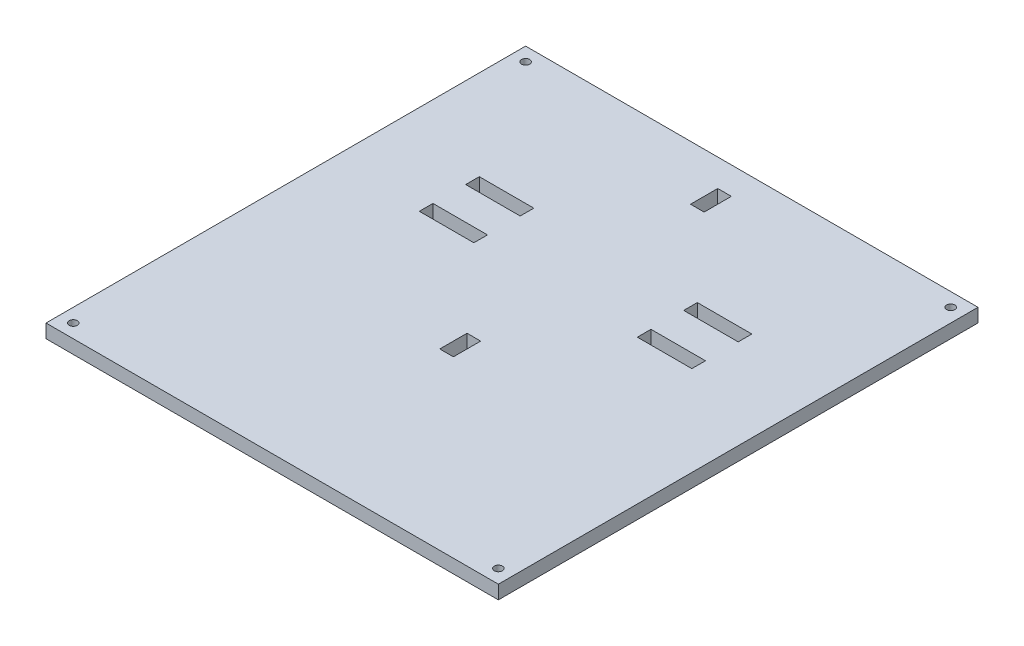
ISO-10303-21;
HEADER;
FILE_DESCRIPTION(('STEP AP214'),'2;1');
FILE_NAME('part.step','',(''),(''),'','','');
FILE_SCHEMA(('AUTOMOTIVE_DESIGN { 1 0 10303 214 1 1 1 1 }'));
ENDSEC;
DATA;
#1=APPLICATION_CONTEXT('core data for automotive mechanical design processes');
#2=APPLICATION_PROTOCOL_DEFINITION('international standard','automotive_design',2000,#1);
#3=PRODUCT_CONTEXT('',#1,'mechanical');
#4=PRODUCT('Part','Part','',(#3));
#5=PRODUCT_RELATED_PRODUCT_CATEGORY('part','',(#4));
#6=PRODUCT_DEFINITION_FORMATION('','',#4);
#7=PRODUCT_DEFINITION_CONTEXT('part definition',#1,'design');
#8=PRODUCT_DEFINITION('design','',#6,#7);
#9=PRODUCT_DEFINITION_SHAPE('','',#8);
#10=(LENGTH_UNIT() NAMED_UNIT(*) SI_UNIT(.MILLI.,.METRE.));
#11=(NAMED_UNIT(*) PLANE_ANGLE_UNIT() SI_UNIT($,.RADIAN.));
#12=(NAMED_UNIT(*) SI_UNIT($,.STERADIAN.) SOLID_ANGLE_UNIT());
#13=UNCERTAINTY_MEASURE_WITH_UNIT(LENGTH_MEASURE(1.E-05),#10,'distance_accuracy_value','');
#14=(GEOMETRIC_REPRESENTATION_CONTEXT(3) GLOBAL_UNCERTAINTY_ASSIGNED_CONTEXT((#13)) GLOBAL_UNIT_ASSIGNED_CONTEXT((#10,
#11,#12)) REPRESENTATION_CONTEXT('',''));
#15=CARTESIAN_POINT('',(0.,0.,0.));
#16=DIRECTION('',(0.,0.,1.));
#17=DIRECTION('',(1.,0.,0.));
#18=AXIS2_PLACEMENT_3D('',#15,#16,#17);
#19=CARTESIAN_POINT('',(0.,5.,0.));
#20=DIRECTION('',(0.,-1.,0.));
#21=DIRECTION('',(0.,0.,-1.));
#22=AXIS2_PLACEMENT_3D('',#19,#20,#21);
#23=PLANE('',#22);
#24=DIRECTION('',(0.,0.,1.));
#25=VECTOR('',#24,1.);
#26=CARTESIAN_POINT('',(80.5,5.,-120.522242689147));
#27=LINE('',#26,#25);
#28=CARTESIAN_POINT('',(80.5,5.,-120.522242689147));
#29=VERTEX_POINT('',#28);
#30=CARTESIAN_POINT('',(80.5,5.,-110.522242689147));
#31=VERTEX_POINT('',#30);
#32=EDGE_CURVE('E259',#29,#31,#27,.T.);
#33=ORIENTED_EDGE('',*,*,#32,.F.);
#34=DIRECTION('',(-1.,0.,0.));
#35=VECTOR('',#34,1.);
#36=CARTESIAN_POINT('',(80.5,5.,-120.522242689147));
#37=LINE('',#36,#35);
#38=CARTESIAN_POINT('',(85.5,5.,-120.522242689147));
#39=VERTEX_POINT('',#38);
#40=EDGE_CURVE('E267',#39,#29,#37,.T.);
#41=ORIENTED_EDGE('',*,*,#40,.F.);
#42=DIRECTION('',(0.,0.,-1.));
#43=VECTOR('',#42,1.);
#44=CARTESIAN_POINT('',(85.5,5.,-120.522242689147));
#45=LINE('',#44,#43);
#46=CARTESIAN_POINT('',(85.5,5.,-110.522242689147));
#47=VERTEX_POINT('',#46);
#48=EDGE_CURVE('E264',#47,#39,#45,.T.);
#49=ORIENTED_EDGE('',*,*,#48,.F.);
#50=DIRECTION('',(1.,0.,0.));
#51=VECTOR('',#50,1.);
#52=CARTESIAN_POINT('',(80.5,5.,-110.522242689147));
#53=LINE('',#52,#51);
#54=EDGE_CURVE('E261',#31,#47,#53,.T.);
#55=ORIENTED_EDGE('',*,*,#54,.F.);
#56=EDGE_LOOP('',(#33,#41,#49,#55));
#57=FACE_BOUND('',#56,.T.);
#58=DIRECTION('',(0.,0.,1.));
#59=VECTOR('',#58,1.);
#60=CARTESIAN_POINT('',(113.,5.,-80.5222426891473));
#61=LINE('',#60,#59);
#62=CARTESIAN_POINT('',(113.,5.,-80.5222426891473));
#63=VERTEX_POINT('',#62);
#64=CARTESIAN_POINT('',(113.,5.,-75.5222426891473));
#65=VERTEX_POINT('',#64);
#66=EDGE_CURVE('E321',#63,#65,#61,.T.);
#67=ORIENTED_EDGE('',*,*,#66,.F.);
#68=DIRECTION('',(-1.,0.,0.));
#69=VECTOR('',#68,1.);
#70=CARTESIAN_POINT('',(113.,5.,-80.5222426891473));
#71=LINE('',#70,#69);
#72=CARTESIAN_POINT('',(133.,5.,-80.5222426891473));
#73=VERTEX_POINT('',#72);
#74=EDGE_CURVE('E329',#73,#63,#71,.T.);
#75=ORIENTED_EDGE('',*,*,#74,.F.);
#76=DIRECTION('',(0.,0.,-1.));
#77=VECTOR('',#76,1.);
#78=CARTESIAN_POINT('',(133.,5.,-80.5222426891473));
#79=LINE('',#78,#77);
#80=CARTESIAN_POINT('',(133.,5.,-75.5222426891473));
#81=VERTEX_POINT('',#80);
#82=EDGE_CURVE('E326',#81,#73,#79,.T.);
#83=ORIENTED_EDGE('',*,*,#82,.F.);
#84=DIRECTION('',(1.,0.,0.));
#85=VECTOR('',#84,1.);
#86=CARTESIAN_POINT('',(113.,5.,-75.5222426891473));
#87=LINE('',#86,#85);
#88=EDGE_CURVE('E323',#65,#81,#87,.T.);
#89=ORIENTED_EDGE('',*,*,#88,.F.);
#90=EDGE_LOOP('',(#67,#75,#83,#89));
#91=FACE_BOUND('',#90,.T.);
#92=DIRECTION('',(0.,0.,-1.));
#93=VECTOR('',#92,1.);
#94=CARTESIAN_POINT('',(53.,5.,-80.5222426891473));
#95=LINE('',#94,#93);
#96=CARTESIAN_POINT('',(53.,5.,-75.5222426891473));
#97=VERTEX_POINT('',#96);
#98=CARTESIAN_POINT('',(53.,5.,-80.5222426891473));
#99=VERTEX_POINT('',#98);
#100=EDGE_CURVE('E383',#97,#99,#95,.T.);
#101=ORIENTED_EDGE('',*,*,#100,.F.);
#102=DIRECTION('',(1.,0.,0.));
#103=VECTOR('',#102,1.);
#104=CARTESIAN_POINT('',(53.,5.,-75.5222426891473));
#105=LINE('',#104,#103);
#106=CARTESIAN_POINT('',(33.,5.,-75.5222426891473));
#107=VERTEX_POINT('',#106);
#108=EDGE_CURVE('E391',#107,#97,#105,.T.);
#109=ORIENTED_EDGE('',*,*,#108,.F.);
#110=DIRECTION('',(0.,0.,1.));
#111=VECTOR('',#110,1.);
#112=CARTESIAN_POINT('',(33.,5.,-80.5222426891473));
#113=LINE('',#112,#111);
#114=CARTESIAN_POINT('',(33.,5.,-80.5222426891473));
#115=VERTEX_POINT('',#114);
#116=EDGE_CURVE('E388',#115,#107,#113,.T.);
#117=ORIENTED_EDGE('',*,*,#116,.F.);
#118=DIRECTION('',(-1.,0.,0.));
#119=VECTOR('',#118,1.);
#120=CARTESIAN_POINT('',(53.,5.,-80.5222426891473));
#121=LINE('',#120,#119);
#122=EDGE_CURVE('E385',#99,#115,#121,.T.);
#123=ORIENTED_EDGE('',*,*,#122,.F.);
#124=EDGE_LOOP('',(#101,#109,#117,#123));
#125=FACE_BOUND('',#124,.T.);
#126=DIRECTION('',(0.,0.,1.));
#127=VECTOR('',#126,1.);
#128=CARTESIAN_POINT('',(0.,5.,45.4777573108528));
#129=LINE('',#128,#127);
#130=CARTESIAN_POINT('',(0.,5.,-130.522242689147));
#131=VERTEX_POINT('',#130);
#132=CARTESIAN_POINT('',(0.,5.,45.4777573108528));
#133=VERTEX_POINT('',#132);
#134=EDGE_CURVE('E414',#131,#133,#129,.T.);
#135=ORIENTED_EDGE('',*,*,#134,.T.);
#136=DIRECTION('',(1.,0.,0.));
#137=VECTOR('',#136,1.);
#138=CARTESIAN_POINT('',(166.,5.,45.4777573108528));
#139=LINE('',#138,#137);
#140=CARTESIAN_POINT('',(166.,5.,45.4777573108528));
#141=VERTEX_POINT('',#140);
#142=EDGE_CURVE('E417',#133,#141,#139,.T.);
#143=ORIENTED_EDGE('',*,*,#142,.T.);
#144=DIRECTION('',(0.,0.,-1.));
#145=VECTOR('',#144,1.);
#146=CARTESIAN_POINT('',(166.,5.,0.));
#147=LINE('',#146,#145);
#148=CARTESIAN_POINT('',(166.,5.,-130.522242689147));
#149=VERTEX_POINT('',#148);
#150=EDGE_CURVE('E420',#141,#149,#147,.T.);
#151=ORIENTED_EDGE('',*,*,#150,.T.);
#152=DIRECTION('',(-1.,0.,0.));
#153=VECTOR('',#152,1.);
#154=CARTESIAN_POINT('',(0.,5.,-130.522242689147));
#155=LINE('',#154,#153);
#156=EDGE_CURVE('E422',#149,#131,#155,.T.);
#157=ORIENTED_EDGE('',*,*,#156,.T.);
#158=EDGE_LOOP('',(#135,#143,#151,#157));
#159=FACE_BOUND('',#158,.T.);
#160=DIRECTION('',(0.,0.,-1.));
#161=VECTOR('',#160,1.);
#162=CARTESIAN_POINT('',(53.,5.,-63.5222426891472));
#163=LINE('',#162,#161);
#164=CARTESIAN_POINT('',(53.,5.,-58.5222426891472));
#165=VERTEX_POINT('',#164);
#166=CARTESIAN_POINT('',(53.,5.,-63.5222426891472));
#167=VERTEX_POINT('',#166);
#168=EDGE_CURVE('E352',#165,#167,#163,.T.);
#169=ORIENTED_EDGE('',*,*,#168,.F.);
#170=DIRECTION('',(1.,0.,0.));
#171=VECTOR('',#170,1.);
#172=CARTESIAN_POINT('',(53.,5.,-58.5222426891472));
#173=LINE('',#172,#171);
#174=CARTESIAN_POINT('',(33.,5.,-58.5222426891472));
#175=VERTEX_POINT('',#174);
#176=EDGE_CURVE('E360',#175,#165,#173,.T.);
#177=ORIENTED_EDGE('',*,*,#176,.F.);
#178=DIRECTION('',(0.,0.,1.));
#179=VECTOR('',#178,1.);
#180=CARTESIAN_POINT('',(33.,5.,-63.5222426891472));
#181=LINE('',#180,#179);
#182=CARTESIAN_POINT('',(33.,5.,-63.5222426891472));
#183=VERTEX_POINT('',#182);
#184=EDGE_CURVE('E357',#183,#175,#181,.T.);
#185=ORIENTED_EDGE('',*,*,#184,.F.);
#186=DIRECTION('',(-1.,0.,0.));
#187=VECTOR('',#186,1.);
#188=CARTESIAN_POINT('',(53.,5.,-63.5222426891472));
#189=LINE('',#188,#187);
#190=EDGE_CURVE('E354',#167,#183,#189,.T.);
#191=ORIENTED_EDGE('',*,*,#190,.F.);
#192=EDGE_LOOP('',(#169,#177,#185,#191));
#193=FACE_BOUND('',#192,.T.);
#194=DIRECTION('',(0.,0.,1.));
#195=VECTOR('',#194,1.);
#196=CARTESIAN_POINT('',(113.,5.,-63.5222426891472));
#197=LINE('',#196,#195);
#198=CARTESIAN_POINT('',(113.,5.,-63.5222426891472));
#199=VERTEX_POINT('',#198);
#200=CARTESIAN_POINT('',(113.,5.,-58.5222426891472));
#201=VERTEX_POINT('',#200);
#202=EDGE_CURVE('E290',#199,#201,#197,.T.);
#203=ORIENTED_EDGE('',*,*,#202,.F.);
#204=DIRECTION('',(-1.,0.,0.));
#205=VECTOR('',#204,1.);
#206=CARTESIAN_POINT('',(113.,5.,-63.5222426891472));
#207=LINE('',#206,#205);
#208=CARTESIAN_POINT('',(133.,5.,-63.5222426891472));
#209=VERTEX_POINT('',#208);
#210=EDGE_CURVE('E298',#209,#199,#207,.T.);
#211=ORIENTED_EDGE('',*,*,#210,.F.);
#212=DIRECTION('',(0.,0.,-1.));
#213=VECTOR('',#212,1.);
#214=CARTESIAN_POINT('',(133.,5.,-63.5222426891472));
#215=LINE('',#214,#213);
#216=CARTESIAN_POINT('',(133.,5.,-58.5222426891472));
#217=VERTEX_POINT('',#216);
#218=EDGE_CURVE('E295',#217,#209,#215,.T.);
#219=ORIENTED_EDGE('',*,*,#218,.F.);
#220=DIRECTION('',(1.,0.,0.));
#221=VECTOR('',#220,1.);
#222=CARTESIAN_POINT('',(113.,5.,-58.5222426891472));
#223=LINE('',#222,#221);
#224=EDGE_CURVE('E292',#201,#217,#223,.T.);
#225=ORIENTED_EDGE('',*,*,#224,.F.);
#226=EDGE_LOOP('',(#203,#211,#219,#225));
#227=FACE_BOUND('',#226,.T.);
#228=DIRECTION('',(0.,0.,1.));
#229=VECTOR('',#228,1.);
#230=CARTESIAN_POINT('',(80.5,5.,-28.5222426891472));
#231=LINE('',#230,#229);
#232=CARTESIAN_POINT('',(80.5,5.,-28.5222426891472));
#233=VERTEX_POINT('',#232);
#234=CARTESIAN_POINT('',(80.5,5.,-18.5222426891472));
#235=VERTEX_POINT('',#234);
#236=EDGE_CURVE('E220',#233,#235,#231,.T.);
#237=ORIENTED_EDGE('',*,*,#236,.F.);
#238=DIRECTION('',(-1.,0.,0.));
#239=VECTOR('',#238,1.);
#240=CARTESIAN_POINT('',(80.5,5.,-28.5222426891472));
#241=LINE('',#240,#239);
#242=CARTESIAN_POINT('',(85.5,5.,-28.5222426891472));
#243=VERTEX_POINT('',#242);
#244=EDGE_CURVE('E243',#243,#233,#241,.T.);
#245=ORIENTED_EDGE('',*,*,#244,.F.);
#246=DIRECTION('',(0.,0.,-1.));
#247=VECTOR('',#246,1.);
#248=CARTESIAN_POINT('',(85.5,5.,-28.5222426891472));
#249=LINE('',#248,#247);
#250=CARTESIAN_POINT('',(85.5,5.,-18.5222426891472));
#251=VERTEX_POINT('',#250);
#252=EDGE_CURVE('E241',#251,#243,#249,.T.);
#253=ORIENTED_EDGE('',*,*,#252,.F.);
#254=DIRECTION('',(1.,0.,0.));
#255=VECTOR('',#254,1.);
#256=CARTESIAN_POINT('',(80.5,5.,-18.5222426891472));
#257=LINE('',#256,#255);
#258=EDGE_CURVE('E228',#235,#251,#257,.T.);
#259=ORIENTED_EDGE('',*,*,#258,.F.);
#260=EDGE_LOOP('',(#237,#245,#253,#259));
#261=FACE_BOUND('',#260,.T.);
#262=CARTESIAN_POINT('',(5.,5.,-125.522242689147));
#263=DIRECTION('',(0.,1.,0.));
#264=DIRECTION('',(0.,0.,1.));
#265=AXIS2_PLACEMENT_3D('',#262,#263,#264);
#266=CIRCLE('',#265,1.5);
#267=CARTESIAN_POINT('',(5.,5.,-124.022242689147));
#268=VERTEX_POINT('',#267);
#269=EDGE_CURVE('E249',#268,#268,#266,.T.);
#270=ORIENTED_EDGE('',*,*,#269,.F.);
#271=EDGE_LOOP('',(#270));
#272=FACE_BOUND('',#271,.T.);
#273=CARTESIAN_POINT('',(161.,5.,-125.522242689147));
#274=DIRECTION('',(0.,1.,0.));
#275=DIRECTION('',(0.,0.,1.));
#276=AXIS2_PLACEMENT_3D('',#273,#274,#275);
#277=CIRCLE('',#276,1.5);
#278=CARTESIAN_POINT('',(161.,5.,-124.022242689147));
#279=VERTEX_POINT('',#278);
#280=EDGE_CURVE('E811',#279,#279,#277,.T.);
#281=ORIENTED_EDGE('',*,*,#280,.F.);
#282=EDGE_LOOP('',(#281));
#283=FACE_BOUND('',#282,.T.);
#284=CARTESIAN_POINT('',(5.00000000000002,5.,40.4777573108528));
#285=DIRECTION('',(0.,1.,0.));
#286=DIRECTION('',(0.,0.,1.));
#287=AXIS2_PLACEMENT_3D('',#284,#285,#286);
#288=CIRCLE('',#287,1.5);
#289=CARTESIAN_POINT('',(5.00000000000002,5.,41.9777573108528));
#290=VERTEX_POINT('',#289);
#291=EDGE_CURVE('E805',#290,#290,#288,.T.);
#292=ORIENTED_EDGE('',*,*,#291,.F.);
#293=EDGE_LOOP('',(#292));
#294=FACE_BOUND('',#293,.T.);
#295=CARTESIAN_POINT('',(161.,5.,40.4777573108528));
#296=DIRECTION('',(0.,1.,0.));
#297=DIRECTION('',(0.,0.,1.));
#298=AXIS2_PLACEMENT_3D('',#295,#296,#297);
#299=CIRCLE('',#298,1.5);
#300=CARTESIAN_POINT('',(161.,5.,41.9777573108528));
#301=VERTEX_POINT('',#300);
#302=EDGE_CURVE('E796',#301,#301,#299,.T.);
#303=ORIENTED_EDGE('',*,*,#302,.F.);
#304=EDGE_LOOP('',(#303));
#305=FACE_BOUND('',#304,.T.);
#306=ADVANCED_FACE('F35',(#57,#91,#125,#159,#193,#227,#261,#272,#283,#294,#305),#23,.F.);
#307=CARTESIAN_POINT('',(0.,0.,0.));
#308=DIRECTION('',(0.,-1.,0.));
#309=DIRECTION('',(0.,0.,-1.));
#310=AXIS2_PLACEMENT_3D('',#307,#308,#309);
#311=PLANE('',#310);
#312=CARTESIAN_POINT('',(5.00000000000002,0.,40.4777573108528));
#313=DIRECTION('',(0.,1.,0.));
#314=DIRECTION('',(0.,0.,1.));
#315=AXIS2_PLACEMENT_3D('',#312,#313,#314);
#316=CIRCLE('',#315,1.5);
#317=CARTESIAN_POINT('',(5.00000000000002,0.,41.9777573108528));
#318=VERTEX_POINT('',#317);
#319=EDGE_CURVE('E802',#318,#318,#316,.T.);
#320=ORIENTED_EDGE('',*,*,#319,.T.);
#321=EDGE_LOOP('',(#320));
#322=FACE_BOUND('',#321,.T.);
#323=CARTESIAN_POINT('',(5.,0.,-125.522242689147));
#324=DIRECTION('',(0.,1.,0.));
#325=DIRECTION('',(0.,0.,1.));
#326=AXIS2_PLACEMENT_3D('',#323,#324,#325);
#327=CIRCLE('',#326,1.5);
#328=CARTESIAN_POINT('',(5.,0.,-124.022242689147));
#329=VERTEX_POINT('',#328);
#330=EDGE_CURVE('E814',#329,#329,#327,.T.);
#331=ORIENTED_EDGE('',*,*,#330,.T.);
#332=EDGE_LOOP('',(#331));
#333=FACE_BOUND('',#332,.T.);
#334=DIRECTION('',(1.,0.,0.));
#335=VECTOR('',#334,1.);
#336=CARTESIAN_POINT('',(166.,0.,45.4777573108528));
#337=LINE('',#336,#335);
#338=CARTESIAN_POINT('',(0.,0.,45.4777573108528));
#339=VERTEX_POINT('',#338);
#340=CARTESIAN_POINT('',(166.,0.,45.4777573108528));
#341=VERTEX_POINT('',#340);
#342=EDGE_CURVE('E413',#339,#341,#337,.T.);
#343=ORIENTED_EDGE('',*,*,#342,.F.);
#344=DIRECTION('',(0.,0.,1.));
#345=VECTOR('',#344,1.);
#346=CARTESIAN_POINT('',(0.,0.,0.));
#347=LINE('',#346,#345);
#348=CARTESIAN_POINT('',(0.,0.,-130.522242689147));
#349=VERTEX_POINT('',#348);
#350=EDGE_CURVE('E418',#349,#339,#347,.T.);
#351=ORIENTED_EDGE('',*,*,#350,.F.);
#352=DIRECTION('',(-1.,0.,0.));
#353=VECTOR('',#352,1.);
#354=CARTESIAN_POINT('',(0.,0.,-130.522242689147));
#355=LINE('',#354,#353);
#356=CARTESIAN_POINT('',(166.,0.,-130.522242689147));
#357=VERTEX_POINT('',#356);
#358=EDGE_CURVE('E430',#357,#349,#355,.T.);
#359=ORIENTED_EDGE('',*,*,#358,.F.);
#360=DIRECTION('',(0.,0.,-1.));
#361=VECTOR('',#360,1.);
#362=CARTESIAN_POINT('',(166.,0.,-130.522242689147));
#363=LINE('',#362,#361);
#364=EDGE_CURVE('E428',#341,#357,#363,.T.);
#365=ORIENTED_EDGE('',*,*,#364,.F.);
#366=EDGE_LOOP('',(#343,#351,#359,#365));
#367=FACE_BOUND('',#366,.T.);
#368=DIRECTION('',(1.,0.,0.));
#369=VECTOR('',#368,1.);
#370=CARTESIAN_POINT('',(53.,0.,-75.5222426891473));
#371=LINE('',#370,#369);
#372=CARTESIAN_POINT('',(33.,0.,-75.5222426891473));
#373=VERTEX_POINT('',#372);
#374=CARTESIAN_POINT('',(53.,0.,-75.5222426891473));
#375=VERTEX_POINT('',#374);
#376=EDGE_CURVE('E386',#373,#375,#371,.T.);
#377=ORIENTED_EDGE('',*,*,#376,.T.);
#378=DIRECTION('',(0.,0.,-1.));
#379=VECTOR('',#378,1.);
#380=CARTESIAN_POINT('',(53.,0.,-80.5222426891473));
#381=LINE('',#380,#379);
#382=CARTESIAN_POINT('',(53.,0.,-80.5222426891473));
#383=VERTEX_POINT('',#382);
#384=EDGE_CURVE('E382',#375,#383,#381,.T.);
#385=ORIENTED_EDGE('',*,*,#384,.T.);
#386=DIRECTION('',(-1.,0.,0.));
#387=VECTOR('',#386,1.);
#388=CARTESIAN_POINT('',(53.,0.,-80.5222426891473));
#389=LINE('',#388,#387);
#390=CARTESIAN_POINT('',(33.,0.,-80.5222426891473));
#391=VERTEX_POINT('',#390);
#392=EDGE_CURVE('E396',#383,#391,#389,.T.);
#393=ORIENTED_EDGE('',*,*,#392,.T.);
#394=DIRECTION('',(0.,0.,1.));
#395=VECTOR('',#394,1.);
#396=CARTESIAN_POINT('',(33.,0.,-80.5222426891473));
#397=LINE('',#396,#395);
#398=EDGE_CURVE('E399',#391,#373,#397,.T.);
#399=ORIENTED_EDGE('',*,*,#398,.T.);
#400=EDGE_LOOP('',(#377,#385,#393,#399));
#401=FACE_BOUND('',#400,.T.);
#402=DIRECTION('',(1.,0.,0.));
#403=VECTOR('',#402,1.);
#404=CARTESIAN_POINT('',(53.,0.,-58.5222426891472));
#405=LINE('',#404,#403);
#406=CARTESIAN_POINT('',(33.,0.,-58.5222426891472));
#407=VERTEX_POINT('',#406);
#408=CARTESIAN_POINT('',(53.,0.,-58.5222426891472));
#409=VERTEX_POINT('',#408);
#410=EDGE_CURVE('E355',#407,#409,#405,.T.);
#411=ORIENTED_EDGE('',*,*,#410,.T.);
#412=DIRECTION('',(0.,0.,-1.));
#413=VECTOR('',#412,1.);
#414=CARTESIAN_POINT('',(53.,0.,-63.5222426891472));
#415=LINE('',#414,#413);
#416=CARTESIAN_POINT('',(53.,0.,-63.5222426891472));
#417=VERTEX_POINT('',#416);
#418=EDGE_CURVE('E351',#409,#417,#415,.T.);
#419=ORIENTED_EDGE('',*,*,#418,.T.);
#420=DIRECTION('',(-1.,0.,0.));
#421=VECTOR('',#420,1.);
#422=CARTESIAN_POINT('',(53.,0.,-63.5222426891472));
#423=LINE('',#422,#421);
#424=CARTESIAN_POINT('',(33.,0.,-63.5222426891472));
#425=VERTEX_POINT('',#424);
#426=EDGE_CURVE('E365',#417,#425,#423,.T.);
#427=ORIENTED_EDGE('',*,*,#426,.T.);
#428=DIRECTION('',(0.,0.,1.));
#429=VECTOR('',#428,1.);
#430=CARTESIAN_POINT('',(33.,0.,-63.5222426891472));
#431=LINE('',#430,#429);
#432=EDGE_CURVE('E368',#425,#407,#431,.T.);
#433=ORIENTED_EDGE('',*,*,#432,.T.);
#434=EDGE_LOOP('',(#411,#419,#427,#433));
#435=FACE_BOUND('',#434,.T.);
#436=DIRECTION('',(-1.,0.,0.));
#437=VECTOR('',#436,1.);
#438=CARTESIAN_POINT('',(113.,0.,-80.5222426891473));
#439=LINE('',#438,#437);
#440=CARTESIAN_POINT('',(133.,0.,-80.5222426891473));
#441=VERTEX_POINT('',#440);
#442=CARTESIAN_POINT('',(113.,0.,-80.5222426891473));
#443=VERTEX_POINT('',#442);
#444=EDGE_CURVE('E324',#441,#443,#439,.T.);
#445=ORIENTED_EDGE('',*,*,#444,.T.);
#446=DIRECTION('',(0.,0.,1.));
#447=VECTOR('',#446,1.);
#448=CARTESIAN_POINT('',(113.,0.,-80.5222426891473));
#449=LINE('',#448,#447);
#450=CARTESIAN_POINT('',(113.,0.,-75.5222426891473));
#451=VERTEX_POINT('',#450);
#452=EDGE_CURVE('E320',#443,#451,#449,.T.);
#453=ORIENTED_EDGE('',*,*,#452,.T.);
#454=DIRECTION('',(1.,0.,0.));
#455=VECTOR('',#454,1.);
#456=CARTESIAN_POINT('',(113.,0.,-75.5222426891473));
#457=LINE('',#456,#455);
#458=CARTESIAN_POINT('',(133.,0.,-75.5222426891473));
#459=VERTEX_POINT('',#458);
#460=EDGE_CURVE('E334',#451,#459,#457,.T.);
#461=ORIENTED_EDGE('',*,*,#460,.T.);
#462=DIRECTION('',(0.,0.,-1.));
#463=VECTOR('',#462,1.);
#464=CARTESIAN_POINT('',(133.,0.,-80.5222426891473));
#465=LINE('',#464,#463);
#466=EDGE_CURVE('E337',#459,#441,#465,.T.);
#467=ORIENTED_EDGE('',*,*,#466,.T.);
#468=EDGE_LOOP('',(#445,#453,#461,#467));
#469=FACE_BOUND('',#468,.T.);
#470=DIRECTION('',(-1.,0.,0.));
#471=VECTOR('',#470,1.);
#472=CARTESIAN_POINT('',(113.,0.,-63.5222426891472));
#473=LINE('',#472,#471);
#474=CARTESIAN_POINT('',(133.,0.,-63.5222426891472));
#475=VERTEX_POINT('',#474);
#476=CARTESIAN_POINT('',(113.,0.,-63.5222426891472));
#477=VERTEX_POINT('',#476);
#478=EDGE_CURVE('E293',#475,#477,#473,.T.);
#479=ORIENTED_EDGE('',*,*,#478,.T.);
#480=DIRECTION('',(0.,0.,1.));
#481=VECTOR('',#480,1.);
#482=CARTESIAN_POINT('',(113.,0.,-63.5222426891472));
#483=LINE('',#482,#481);
#484=CARTESIAN_POINT('',(113.,0.,-58.5222426891472));
#485=VERTEX_POINT('',#484);
#486=EDGE_CURVE('E289',#477,#485,#483,.T.);
#487=ORIENTED_EDGE('',*,*,#486,.T.);
#488=DIRECTION('',(1.,0.,0.));
#489=VECTOR('',#488,1.);
#490=CARTESIAN_POINT('',(113.,0.,-58.5222426891472));
#491=LINE('',#490,#489);
#492=CARTESIAN_POINT('',(133.,0.,-58.5222426891472));
#493=VERTEX_POINT('',#492);
#494=EDGE_CURVE('E303',#485,#493,#491,.T.);
#495=ORIENTED_EDGE('',*,*,#494,.T.);
#496=DIRECTION('',(0.,0.,-1.));
#497=VECTOR('',#496,1.);
#498=CARTESIAN_POINT('',(133.,0.,-63.5222426891472));
#499=LINE('',#498,#497);
#500=EDGE_CURVE('E306',#493,#475,#499,.T.);
#501=ORIENTED_EDGE('',*,*,#500,.T.);
#502=EDGE_LOOP('',(#479,#487,#495,#501));
#503=FACE_BOUND('',#502,.T.);
#504=DIRECTION('',(-1.,0.,0.));
#505=VECTOR('',#504,1.);
#506=CARTESIAN_POINT('',(80.5,0.,-120.522242689147));
#507=LINE('',#506,#505);
#508=CARTESIAN_POINT('',(85.5,0.,-120.522242689147));
#509=VERTEX_POINT('',#508);
#510=CARTESIAN_POINT('',(80.5,0.,-120.522242689147));
#511=VERTEX_POINT('',#510);
#512=EDGE_CURVE('E262',#509,#511,#507,.T.);
#513=ORIENTED_EDGE('',*,*,#512,.T.);
#514=DIRECTION('',(0.,0.,1.));
#515=VECTOR('',#514,1.);
#516=CARTESIAN_POINT('',(80.5,0.,-120.522242689147));
#517=LINE('',#516,#515);
#518=CARTESIAN_POINT('',(80.5,0.,-110.522242689147));
#519=VERTEX_POINT('',#518);
#520=EDGE_CURVE('E236',#511,#519,#517,.T.);
#521=ORIENTED_EDGE('',*,*,#520,.T.);
#522=DIRECTION('',(1.,0.,0.));
#523=VECTOR('',#522,1.);
#524=CARTESIAN_POINT('',(80.5,0.,-110.522242689147));
#525=LINE('',#524,#523);
#526=CARTESIAN_POINT('',(85.5,0.,-110.522242689147));
#527=VERTEX_POINT('',#526);
#528=EDGE_CURVE('E272',#519,#527,#525,.T.);
#529=ORIENTED_EDGE('',*,*,#528,.T.);
#530=DIRECTION('',(0.,0.,-1.));
#531=VECTOR('',#530,1.);
#532=CARTESIAN_POINT('',(85.5,0.,-120.522242689147));
#533=LINE('',#532,#531);
#534=EDGE_CURVE('E275',#527,#509,#533,.T.);
#535=ORIENTED_EDGE('',*,*,#534,.T.);
#536=EDGE_LOOP('',(#513,#521,#529,#535));
#537=FACE_BOUND('',#536,.T.);
#538=DIRECTION('',(-1.,0.,0.));
#539=VECTOR('',#538,1.);
#540=CARTESIAN_POINT('',(80.5,0.,-28.5222426891472));
#541=LINE('',#540,#539);
#542=CARTESIAN_POINT('',(85.5,0.,-28.5222426891472));
#543=VERTEX_POINT('',#542);
#544=CARTESIAN_POINT('',(80.5,0.,-28.5222426891472));
#545=VERTEX_POINT('',#544);
#546=EDGE_CURVE('E229',#543,#545,#541,.T.);
#547=ORIENTED_EDGE('',*,*,#546,.T.);
#548=DIRECTION('',(0.,0.,1.));
#549=VECTOR('',#548,1.);
#550=CARTESIAN_POINT('',(80.5,0.,-28.5222426891472));
#551=LINE('',#550,#549);
#552=CARTESIAN_POINT('',(80.5,0.,-18.5222426891472));
#553=VERTEX_POINT('',#552);
#554=EDGE_CURVE('E58',#545,#553,#551,.T.);
#555=ORIENTED_EDGE('',*,*,#554,.T.);
#556=DIRECTION('',(1.,0.,0.));
#557=VECTOR('',#556,1.);
#558=CARTESIAN_POINT('',(80.5,0.,-18.5222426891472));
#559=LINE('',#558,#557);
#560=CARTESIAN_POINT('',(85.5,0.,-18.5222426891472));
#561=VERTEX_POINT('',#560);
#562=EDGE_CURVE('E235',#553,#561,#559,.T.);
#563=ORIENTED_EDGE('',*,*,#562,.T.);
#564=DIRECTION('',(0.,0.,-1.));
#565=VECTOR('',#564,1.);
#566=CARTESIAN_POINT('',(85.5,0.,-28.5222426891472));
#567=LINE('',#566,#565);
#568=EDGE_CURVE('E251',#561,#543,#567,.T.);
#569=ORIENTED_EDGE('',*,*,#568,.T.);
#570=EDGE_LOOP('',(#547,#555,#563,#569));
#571=FACE_BOUND('',#570,.T.);
#572=CARTESIAN_POINT('',(161.,0.,-125.522242689147));
#573=DIRECTION('',(0.,1.,0.));
#574=DIRECTION('',(0.,0.,1.));
#575=AXIS2_PLACEMENT_3D('',#572,#573,#574);
#576=CIRCLE('',#575,1.5);
#577=CARTESIAN_POINT('',(161.,0.,-124.022242689147));
#578=VERTEX_POINT('',#577);
#579=EDGE_CURVE('E808',#578,#578,#576,.T.);
#580=ORIENTED_EDGE('',*,*,#579,.T.);
#581=EDGE_LOOP('',(#580));
#582=FACE_BOUND('',#581,.T.);
#583=CARTESIAN_POINT('',(161.,0.,40.4777573108528));
#584=DIRECTION('',(0.,1.,0.));
#585=DIRECTION('',(0.,0.,1.));
#586=AXIS2_PLACEMENT_3D('',#583,#584,#585);
#587=CIRCLE('',#586,1.5);
#588=CARTESIAN_POINT('',(161.,0.,41.9777573108528));
#589=VERTEX_POINT('',#588);
#590=EDGE_CURVE('E799',#589,#589,#587,.T.);
#591=ORIENTED_EDGE('',*,*,#590,.T.);
#592=EDGE_LOOP('',(#591));
#593=FACE_BOUND('',#592,.T.);
#594=ADVANCED_FACE('F448',(#322,#333,#367,#401,#435,#469,#503,#537,#571,#582,#593),#311,.T.);
#595=CARTESIAN_POINT('',(166.,5.,45.4777573108528));
#596=DIRECTION('',(0.,0.,-1.));
#597=DIRECTION('',(-1.,0.,0.));
#598=AXIS2_PLACEMENT_3D('',#595,#596,#597);
#599=PLANE('',#598);
#600=ORIENTED_EDGE('',*,*,#342,.T.);
#601=DIRECTION('',(0.,-1.,0.));
#602=VECTOR('',#601,1.);
#603=CARTESIAN_POINT('',(166.,5.,45.4777573108528));
#604=LINE('',#603,#602);
#605=EDGE_CURVE('E43',#141,#341,#604,.T.);
#606=ORIENTED_EDGE('',*,*,#605,.F.);
#607=ORIENTED_EDGE('',*,*,#142,.F.);
#608=DIRECTION('',(0.,-1.,0.));
#609=VECTOR('',#608,1.);
#610=CARTESIAN_POINT('',(0.,5.,45.4777573108528));
#611=LINE('',#610,#609);
#612=EDGE_CURVE('E11',#133,#339,#611,.T.);
#613=ORIENTED_EDGE('',*,*,#612,.T.);
#614=EDGE_LOOP('',(#600,#606,#607,#613));
#615=FACE_BOUND('',#614,.T.);
#616=ADVANCED_FACE('F37',(#615),#599,.F.);
#617=CARTESIAN_POINT('',(166.,5.,-130.522242689147));
#618=DIRECTION('',(-1.,0.,0.));
#619=DIRECTION('',(0.,0.,1.));
#620=AXIS2_PLACEMENT_3D('',#617,#618,#619);
#621=PLANE('',#620);
#622=ORIENTED_EDGE('',*,*,#364,.T.);
#623=DIRECTION('',(0.,-1.,0.));
#624=VECTOR('',#623,1.);
#625=CARTESIAN_POINT('',(166.,5.,-130.522242689147));
#626=LINE('',#625,#624);
#627=EDGE_CURVE('E436',#149,#357,#626,.T.);
#628=ORIENTED_EDGE('',*,*,#627,.F.);
#629=ORIENTED_EDGE('',*,*,#150,.F.);
#630=ORIENTED_EDGE('',*,*,#605,.T.);
#631=EDGE_LOOP('',(#622,#628,#629,#630));
#632=FACE_BOUND('',#631,.T.);
#633=ADVANCED_FACE('F442',(#632),#621,.F.);
#634=CARTESIAN_POINT('',(0.,5.,-130.522242689147));
#635=DIRECTION('',(0.,0.,1.));
#636=DIRECTION('',(1.,0.,0.));
#637=AXIS2_PLACEMENT_3D('',#634,#635,#636);
#638=PLANE('',#637);
#639=ORIENTED_EDGE('',*,*,#358,.T.);
#640=DIRECTION('',(0.,-1.,0.));
#641=VECTOR('',#640,1.);
#642=CARTESIAN_POINT('',(0.,5.,-130.522242689147));
#643=LINE('',#642,#641);
#644=EDGE_CURVE('E425',#131,#349,#643,.T.);
#645=ORIENTED_EDGE('',*,*,#644,.F.);
#646=ORIENTED_EDGE('',*,*,#156,.F.);
#647=ORIENTED_EDGE('',*,*,#627,.T.);
#648=EDGE_LOOP('',(#639,#645,#646,#647));
#649=FACE_BOUND('',#648,.T.);
#650=ADVANCED_FACE('F453',(#649),#638,.F.);
#651=CARTESIAN_POINT('',(0.,5.,0.));
#652=DIRECTION('',(1.,0.,0.));
#653=DIRECTION('',(0.,0.,-1.));
#654=AXIS2_PLACEMENT_3D('',#651,#652,#653);
#655=PLANE('',#654);
#656=ORIENTED_EDGE('',*,*,#350,.T.);
#657=ORIENTED_EDGE('',*,*,#612,.F.);
#658=ORIENTED_EDGE('',*,*,#134,.F.);
#659=ORIENTED_EDGE('',*,*,#644,.T.);
#660=EDGE_LOOP('',(#656,#657,#658,#659));
#661=FACE_BOUND('',#660,.T.);
#662=ADVANCED_FACE('F456',(#661),#655,.F.);
#663=CARTESIAN_POINT('',(53.,5.,-80.5222426891473));
#664=DIRECTION('',(-1.,0.,0.));
#665=DIRECTION('',(0.,0.,1.));
#666=AXIS2_PLACEMENT_3D('',#663,#664,#665);
#667=PLANE('',#666);
#668=ORIENTED_EDGE('',*,*,#384,.F.);
#669=DIRECTION('',(0.,-1.,0.));
#670=VECTOR('',#669,1.);
#671=CARTESIAN_POINT('',(53.,5.,-75.5222426891473));
#672=LINE('',#671,#670);
#673=EDGE_CURVE('E393',#97,#375,#672,.T.);
#674=ORIENTED_EDGE('',*,*,#673,.F.);
#675=ORIENTED_EDGE('',*,*,#100,.T.);
#676=DIRECTION('',(0.,-1.,0.));
#677=VECTOR('',#676,1.);
#678=CARTESIAN_POINT('',(53.,5.,-80.5222426891473));
#679=LINE('',#678,#677);
#680=EDGE_CURVE('E410',#99,#383,#679,.T.);
#681=ORIENTED_EDGE('',*,*,#680,.T.);
#682=EDGE_LOOP('',(#668,#674,#675,#681));
#683=FACE_BOUND('',#682,.T.);
#684=ADVANCED_FACE('F541',(#683),#667,.T.);
#685=CARTESIAN_POINT('',(53.,5.,-80.5222426891473));
#686=DIRECTION('',(0.,0.,1.));
#687=DIRECTION('',(1.,0.,0.));
#688=AXIS2_PLACEMENT_3D('',#685,#686,#687);
#689=PLANE('',#688);
#690=ORIENTED_EDGE('',*,*,#392,.F.);
#691=ORIENTED_EDGE('',*,*,#680,.F.);
#692=ORIENTED_EDGE('',*,*,#122,.T.);
#693=DIRECTION('',(0.,-1.,0.));
#694=VECTOR('',#693,1.);
#695=CARTESIAN_POINT('',(33.,5.,-80.5222426891473));
#696=LINE('',#695,#694);
#697=EDGE_CURVE('E408',#115,#391,#696,.T.);
#698=ORIENTED_EDGE('',*,*,#697,.T.);
#699=EDGE_LOOP('',(#690,#691,#692,#698));
#700=FACE_BOUND('',#699,.T.);
#701=ADVANCED_FACE('F537',(#700),#689,.T.);
#702=CARTESIAN_POINT('',(33.,5.,-80.5222426891473));
#703=DIRECTION('',(1.,0.,0.));
#704=DIRECTION('',(0.,0.,-1.));
#705=AXIS2_PLACEMENT_3D('',#702,#703,#704);
#706=PLANE('',#705);
#707=ORIENTED_EDGE('',*,*,#398,.F.);
#708=ORIENTED_EDGE('',*,*,#697,.F.);
#709=ORIENTED_EDGE('',*,*,#116,.T.);
#710=DIRECTION('',(0.,-1.,0.));
#711=VECTOR('',#710,1.);
#712=CARTESIAN_POINT('',(33.,5.,-75.5222426891473));
#713=LINE('',#712,#711);
#714=EDGE_CURVE('E406',#107,#373,#713,.T.);
#715=ORIENTED_EDGE('',*,*,#714,.T.);
#716=EDGE_LOOP('',(#707,#708,#709,#715));
#717=FACE_BOUND('',#716,.T.);
#718=ADVANCED_FACE('F533',(#717),#706,.T.);
#719=CARTESIAN_POINT('',(53.,5.,-75.5222426891473));
#720=DIRECTION('',(0.,0.,-1.));
#721=DIRECTION('',(-1.,0.,0.));
#722=AXIS2_PLACEMENT_3D('',#719,#720,#721);
#723=PLANE('',#722);
#724=ORIENTED_EDGE('',*,*,#376,.F.);
#725=ORIENTED_EDGE('',*,*,#714,.F.);
#726=ORIENTED_EDGE('',*,*,#108,.T.);
#727=ORIENTED_EDGE('',*,*,#673,.T.);
#728=EDGE_LOOP('',(#724,#725,#726,#727));
#729=FACE_BOUND('',#728,.T.);
#730=ADVANCED_FACE('F529',(#729),#723,.T.);
#731=CARTESIAN_POINT('',(53.,5.,-63.5222426891472));
#732=DIRECTION('',(-1.,0.,0.));
#733=DIRECTION('',(0.,0.,1.));
#734=AXIS2_PLACEMENT_3D('',#731,#732,#733);
#735=PLANE('',#734);
#736=ORIENTED_EDGE('',*,*,#418,.F.);
#737=DIRECTION('',(0.,-1.,0.));
#738=VECTOR('',#737,1.);
#739=CARTESIAN_POINT('',(53.,5.,-58.5222426891472));
#740=LINE('',#739,#738);
#741=EDGE_CURVE('E362',#165,#409,#740,.T.);
#742=ORIENTED_EDGE('',*,*,#741,.F.);
#743=ORIENTED_EDGE('',*,*,#168,.T.);
#744=DIRECTION('',(0.,-1.,0.));
#745=VECTOR('',#744,1.);
#746=CARTESIAN_POINT('',(53.,5.,-63.5222426891472));
#747=LINE('',#746,#745);
#748=EDGE_CURVE('E379',#167,#417,#747,.T.);
#749=ORIENTED_EDGE('',*,*,#748,.T.);
#750=EDGE_LOOP('',(#736,#742,#743,#749));
#751=FACE_BOUND('',#750,.T.);
#752=ADVANCED_FACE('F525',(#751),#735,.T.);
#753=CARTESIAN_POINT('',(53.,5.,-63.5222426891472));
#754=DIRECTION('',(0.,0.,1.));
#755=DIRECTION('',(1.,0.,0.));
#756=AXIS2_PLACEMENT_3D('',#753,#754,#755);
#757=PLANE('',#756);
#758=ORIENTED_EDGE('',*,*,#426,.F.);
#759=ORIENTED_EDGE('',*,*,#748,.F.);
#760=ORIENTED_EDGE('',*,*,#190,.T.);
#761=DIRECTION('',(0.,-1.,0.));
#762=VECTOR('',#761,1.);
#763=CARTESIAN_POINT('',(33.,5.,-63.5222426891472));
#764=LINE('',#763,#762);
#765=EDGE_CURVE('E377',#183,#425,#764,.T.);
#766=ORIENTED_EDGE('',*,*,#765,.T.);
#767=EDGE_LOOP('',(#758,#759,#760,#766));
#768=FACE_BOUND('',#767,.T.);
#769=ADVANCED_FACE('F521',(#768),#757,.T.);
#770=CARTESIAN_POINT('',(33.,5.,-63.5222426891472));
#771=DIRECTION('',(1.,0.,0.));
#772=DIRECTION('',(0.,0.,-1.));
#773=AXIS2_PLACEMENT_3D('',#770,#771,#772);
#774=PLANE('',#773);
#775=ORIENTED_EDGE('',*,*,#432,.F.);
#776=ORIENTED_EDGE('',*,*,#765,.F.);
#777=ORIENTED_EDGE('',*,*,#184,.T.);
#778=DIRECTION('',(0.,-1.,0.));
#779=VECTOR('',#778,1.);
#780=CARTESIAN_POINT('',(33.,5.,-58.5222426891472));
#781=LINE('',#780,#779);
#782=EDGE_CURVE('E375',#175,#407,#781,.T.);
#783=ORIENTED_EDGE('',*,*,#782,.T.);
#784=EDGE_LOOP('',(#775,#776,#777,#783));
#785=FACE_BOUND('',#784,.T.);
#786=ADVANCED_FACE('F517',(#785),#774,.T.);
#787=CARTESIAN_POINT('',(53.,5.,-58.5222426891472));
#788=DIRECTION('',(0.,0.,-1.));
#789=DIRECTION('',(-1.,0.,0.));
#790=AXIS2_PLACEMENT_3D('',#787,#788,#789);
#791=PLANE('',#790);
#792=ORIENTED_EDGE('',*,*,#410,.F.);
#793=ORIENTED_EDGE('',*,*,#782,.F.);
#794=ORIENTED_EDGE('',*,*,#176,.T.);
#795=ORIENTED_EDGE('',*,*,#741,.T.);
#796=EDGE_LOOP('',(#792,#793,#794,#795));
#797=FACE_BOUND('',#796,.T.);
#798=ADVANCED_FACE('F513',(#797),#791,.T.);
#799=CARTESIAN_POINT('',(113.,5.,-80.5222426891473));
#800=DIRECTION('',(1.,0.,0.));
#801=DIRECTION('',(0.,0.,-1.));
#802=AXIS2_PLACEMENT_3D('',#799,#800,#801);
#803=PLANE('',#802);
#804=ORIENTED_EDGE('',*,*,#452,.F.);
#805=DIRECTION('',(0.,-1.,0.));
#806=VECTOR('',#805,1.);
#807=CARTESIAN_POINT('',(113.,5.,-80.5222426891473));
#808=LINE('',#807,#806);
#809=EDGE_CURVE('E331',#63,#443,#808,.T.);
#810=ORIENTED_EDGE('',*,*,#809,.F.);
#811=ORIENTED_EDGE('',*,*,#66,.T.);
#812=DIRECTION('',(0.,-1.,0.));
#813=VECTOR('',#812,1.);
#814=CARTESIAN_POINT('',(113.,5.,-75.5222426891473));
#815=LINE('',#814,#813);
#816=EDGE_CURVE('E348',#65,#451,#815,.T.);
#817=ORIENTED_EDGE('',*,*,#816,.T.);
#818=EDGE_LOOP('',(#804,#810,#811,#817));
#819=FACE_BOUND('',#818,.T.);
#820=ADVANCED_FACE('F509',(#819),#803,.T.);
#821=CARTESIAN_POINT('',(113.,5.,-75.5222426891473));
#822=DIRECTION('',(0.,0.,-1.));
#823=DIRECTION('',(-1.,0.,0.));
#824=AXIS2_PLACEMENT_3D('',#821,#822,#823);
#825=PLANE('',#824);
#826=ORIENTED_EDGE('',*,*,#460,.F.);
#827=ORIENTED_EDGE('',*,*,#816,.F.);
#828=ORIENTED_EDGE('',*,*,#88,.T.);
#829=DIRECTION('',(0.,-1.,0.));
#830=VECTOR('',#829,1.);
#831=CARTESIAN_POINT('',(133.,5.,-75.5222426891473));
#832=LINE('',#831,#830);
#833=EDGE_CURVE('E346',#81,#459,#832,.T.);
#834=ORIENTED_EDGE('',*,*,#833,.T.);
#835=EDGE_LOOP('',(#826,#827,#828,#834));
#836=FACE_BOUND('',#835,.T.);
#837=ADVANCED_FACE('F505',(#836),#825,.T.);
#838=CARTESIAN_POINT('',(133.,5.,-80.5222426891473));
#839=DIRECTION('',(-1.,0.,0.));
#840=DIRECTION('',(0.,0.,1.));
#841=AXIS2_PLACEMENT_3D('',#838,#839,#840);
#842=PLANE('',#841);
#843=ORIENTED_EDGE('',*,*,#466,.F.);
#844=ORIENTED_EDGE('',*,*,#833,.F.);
#845=ORIENTED_EDGE('',*,*,#82,.T.);
#846=DIRECTION('',(0.,-1.,0.));
#847=VECTOR('',#846,1.);
#848=CARTESIAN_POINT('',(133.,5.,-80.5222426891473));
#849=LINE('',#848,#847);
#850=EDGE_CURVE('E344',#73,#441,#849,.T.);
#851=ORIENTED_EDGE('',*,*,#850,.T.);
#852=EDGE_LOOP('',(#843,#844,#845,#851));
#853=FACE_BOUND('',#852,.T.);
#854=ADVANCED_FACE('F501',(#853),#842,.T.);
#855=CARTESIAN_POINT('',(113.,5.,-80.5222426891473));
#856=DIRECTION('',(0.,0.,1.));
#857=DIRECTION('',(1.,0.,0.));
#858=AXIS2_PLACEMENT_3D('',#855,#856,#857);
#859=PLANE('',#858);
#860=ORIENTED_EDGE('',*,*,#444,.F.);
#861=ORIENTED_EDGE('',*,*,#850,.F.);
#862=ORIENTED_EDGE('',*,*,#74,.T.);
#863=ORIENTED_EDGE('',*,*,#809,.T.);
#864=EDGE_LOOP('',(#860,#861,#862,#863));
#865=FACE_BOUND('',#864,.T.);
#866=ADVANCED_FACE('F498',(#865),#859,.T.);
#867=CARTESIAN_POINT('',(113.,5.,-63.5222426891472));
#868=DIRECTION('',(1.,0.,0.));
#869=DIRECTION('',(0.,0.,-1.));
#870=AXIS2_PLACEMENT_3D('',#867,#868,#869);
#871=PLANE('',#870);
#872=ORIENTED_EDGE('',*,*,#486,.F.);
#873=DIRECTION('',(0.,-1.,0.));
#874=VECTOR('',#873,1.);
#875=CARTESIAN_POINT('',(113.,5.,-63.5222426891472));
#876=LINE('',#875,#874);
#877=EDGE_CURVE('E300',#199,#477,#876,.T.);
#878=ORIENTED_EDGE('',*,*,#877,.F.);
#879=ORIENTED_EDGE('',*,*,#202,.T.);
#880=DIRECTION('',(0.,-1.,0.));
#881=VECTOR('',#880,1.);
#882=CARTESIAN_POINT('',(113.,5.,-58.5222426891472));
#883=LINE('',#882,#881);
#884=EDGE_CURVE('E317',#201,#485,#883,.T.);
#885=ORIENTED_EDGE('',*,*,#884,.T.);
#886=EDGE_LOOP('',(#872,#878,#879,#885));
#887=FACE_BOUND('',#886,.T.);
#888=ADVANCED_FACE('F473',(#887),#871,.T.);
#889=CARTESIAN_POINT('',(113.,5.,-58.5222426891472));
#890=DIRECTION('',(0.,0.,-1.));
#891=DIRECTION('',(-1.,0.,0.));
#892=AXIS2_PLACEMENT_3D('',#889,#890,#891);
#893=PLANE('',#892);
#894=ORIENTED_EDGE('',*,*,#494,.F.);
#895=ORIENTED_EDGE('',*,*,#884,.F.);
#896=ORIENTED_EDGE('',*,*,#224,.T.);
#897=DIRECTION('',(0.,-1.,0.));
#898=VECTOR('',#897,1.);
#899=CARTESIAN_POINT('',(133.,5.,-58.5222426891472));
#900=LINE('',#899,#898);
#901=EDGE_CURVE('E315',#217,#493,#900,.T.);
#902=ORIENTED_EDGE('',*,*,#901,.T.);
#903=EDGE_LOOP('',(#894,#895,#896,#902));
#904=FACE_BOUND('',#903,.T.);
#905=ADVANCED_FACE('F475',(#904),#893,.T.);
#906=CARTESIAN_POINT('',(133.,5.,-63.5222426891472));
#907=DIRECTION('',(-1.,0.,0.));
#908=DIRECTION('',(0.,0.,1.));
#909=AXIS2_PLACEMENT_3D('',#906,#907,#908);
#910=PLANE('',#909);
#911=ORIENTED_EDGE('',*,*,#500,.F.);
#912=ORIENTED_EDGE('',*,*,#901,.F.);
#913=ORIENTED_EDGE('',*,*,#218,.T.);
#914=DIRECTION('',(0.,-1.,0.));
#915=VECTOR('',#914,1.);
#916=CARTESIAN_POINT('',(133.,5.,-63.5222426891472));
#917=LINE('',#916,#915);
#918=EDGE_CURVE('E313',#209,#475,#917,.T.);
#919=ORIENTED_EDGE('',*,*,#918,.T.);
#920=EDGE_LOOP('',(#911,#912,#913,#919));
#921=FACE_BOUND('',#920,.T.);
#922=ADVANCED_FACE('F484',(#921),#910,.T.);
#923=CARTESIAN_POINT('',(113.,5.,-63.5222426891472));
#924=DIRECTION('',(0.,0.,1.));
#925=DIRECTION('',(1.,0.,0.));
#926=AXIS2_PLACEMENT_3D('',#923,#924,#925);
#927=PLANE('',#926);
#928=ORIENTED_EDGE('',*,*,#478,.F.);
#929=ORIENTED_EDGE('',*,*,#918,.F.);
#930=ORIENTED_EDGE('',*,*,#210,.T.);
#931=ORIENTED_EDGE('',*,*,#877,.T.);
#932=EDGE_LOOP('',(#928,#929,#930,#931));
#933=FACE_BOUND('',#932,.T.);
#934=ADVANCED_FACE('F482',(#933),#927,.T.);
#935=CARTESIAN_POINT('',(80.5,5.,-120.522242689147));
#936=DIRECTION('',(1.,0.,0.));
#937=DIRECTION('',(0.,0.,-1.));
#938=AXIS2_PLACEMENT_3D('',#935,#936,#937);
#939=PLANE('',#938);
#940=ORIENTED_EDGE('',*,*,#520,.F.);
#941=DIRECTION('',(0.,-1.,0.));
#942=VECTOR('',#941,1.);
#943=CARTESIAN_POINT('',(80.5,5.,-120.522242689147));
#944=LINE('',#943,#942);
#945=EDGE_CURVE('E269',#29,#511,#944,.T.);
#946=ORIENTED_EDGE('',*,*,#945,.F.);
#947=ORIENTED_EDGE('',*,*,#32,.T.);
#948=DIRECTION('',(0.,-1.,0.));
#949=VECTOR('',#948,1.);
#950=CARTESIAN_POINT('',(80.5,5.,-110.522242689147));
#951=LINE('',#950,#949);
#952=EDGE_CURVE('E286',#31,#519,#951,.T.);
#953=ORIENTED_EDGE('',*,*,#952,.T.);
#954=EDGE_LOOP('',(#940,#946,#947,#953));
#955=FACE_BOUND('',#954,.T.);
#956=ADVANCED_FACE('F491',(#955),#939,.T.);
#957=CARTESIAN_POINT('',(80.5,5.,-110.522242689147));
#958=DIRECTION('',(0.,0.,-1.));
#959=DIRECTION('',(-1.,0.,0.));
#960=AXIS2_PLACEMENT_3D('',#957,#958,#959);
#961=PLANE('',#960);
#962=ORIENTED_EDGE('',*,*,#528,.F.);
#963=ORIENTED_EDGE('',*,*,#952,.F.);
#964=ORIENTED_EDGE('',*,*,#54,.T.);
#965=DIRECTION('',(0.,-1.,0.));
#966=VECTOR('',#965,1.);
#967=CARTESIAN_POINT('',(85.5,5.,-110.522242689147));
#968=LINE('',#967,#966);
#969=EDGE_CURVE('E284',#47,#527,#968,.T.);
#970=ORIENTED_EDGE('',*,*,#969,.T.);
#971=EDGE_LOOP('',(#962,#963,#964,#970));
#972=FACE_BOUND('',#971,.T.);
#973=ADVANCED_FACE('F685',(#972),#961,.T.);
#974=CARTESIAN_POINT('',(85.5,5.,-120.522242689147));
#975=DIRECTION('',(-1.,0.,0.));
#976=DIRECTION('',(0.,0.,1.));
#977=AXIS2_PLACEMENT_3D('',#974,#975,#976);
#978=PLANE('',#977);
#979=ORIENTED_EDGE('',*,*,#534,.F.);
#980=ORIENTED_EDGE('',*,*,#969,.F.);
#981=ORIENTED_EDGE('',*,*,#48,.T.);
#982=DIRECTION('',(0.,-1.,0.));
#983=VECTOR('',#982,1.);
#984=CARTESIAN_POINT('',(85.5,5.,-120.522242689147));
#985=LINE('',#984,#983);
#986=EDGE_CURVE('E282',#39,#509,#985,.T.);
#987=ORIENTED_EDGE('',*,*,#986,.T.);
#988=EDGE_LOOP('',(#979,#980,#981,#987));
#989=FACE_BOUND('',#988,.T.);
#990=ADVANCED_FACE('F693',(#989),#978,.T.);
#991=CARTESIAN_POINT('',(80.5,5.,-120.522242689147));
#992=DIRECTION('',(0.,0.,1.));
#993=DIRECTION('',(1.,0.,0.));
#994=AXIS2_PLACEMENT_3D('',#991,#992,#993);
#995=PLANE('',#994);
#996=ORIENTED_EDGE('',*,*,#512,.F.);
#997=ORIENTED_EDGE('',*,*,#986,.F.);
#998=ORIENTED_EDGE('',*,*,#40,.T.);
#999=ORIENTED_EDGE('',*,*,#945,.T.);
#1000=EDGE_LOOP('',(#996,#997,#998,#999));
#1001=FACE_BOUND('',#1000,.T.);
#1002=ADVANCED_FACE('F702',(#1001),#995,.T.);
#1003=CARTESIAN_POINT('',(80.5,5.,-28.5222426891472));
#1004=DIRECTION('',(1.,0.,0.));
#1005=DIRECTION('',(0.,0.,-1.));
#1006=AXIS2_PLACEMENT_3D('',#1003,#1004,#1005);
#1007=PLANE('',#1006);
#1008=ORIENTED_EDGE('',*,*,#554,.F.);
#1009=DIRECTION('',(0.,-1.,0.));
#1010=VECTOR('',#1009,1.);
#1011=CARTESIAN_POINT('',(80.5,5.,-28.5222426891472));
#1012=LINE('',#1011,#1010);
#1013=EDGE_CURVE('E224',#233,#545,#1012,.T.);
#1014=ORIENTED_EDGE('',*,*,#1013,.F.);
#1015=ORIENTED_EDGE('',*,*,#236,.T.);
#1016=DIRECTION('',(0.,-1.,0.));
#1017=VECTOR('',#1016,1.);
#1018=CARTESIAN_POINT('',(80.5,5.,-18.5222426891472));
#1019=LINE('',#1018,#1017);
#1020=EDGE_CURVE('E223',#235,#553,#1019,.T.);
#1021=ORIENTED_EDGE('',*,*,#1020,.T.);
#1022=EDGE_LOOP('',(#1008,#1014,#1015,#1021));
#1023=FACE_BOUND('',#1022,.T.);
#1024=ADVANCED_FACE('F222',(#1023),#1007,.T.);
#1025=CARTESIAN_POINT('',(80.5,5.,-18.5222426891472));
#1026=DIRECTION('',(0.,0.,-1.));
#1027=DIRECTION('',(-1.,0.,0.));
#1028=AXIS2_PLACEMENT_3D('',#1025,#1026,#1027);
#1029=PLANE('',#1028);
#1030=ORIENTED_EDGE('',*,*,#562,.F.);
#1031=ORIENTED_EDGE('',*,*,#1020,.F.);
#1032=ORIENTED_EDGE('',*,*,#258,.T.);
#1033=DIRECTION('',(0.,-1.,0.));
#1034=VECTOR('',#1033,1.);
#1035=CARTESIAN_POINT('',(85.5,5.,-18.5222426891472));
#1036=LINE('',#1035,#1034);
#1037=EDGE_CURVE('E237',#251,#561,#1036,.T.);
#1038=ORIENTED_EDGE('',*,*,#1037,.T.);
#1039=EDGE_LOOP('',(#1030,#1031,#1032,#1038));
#1040=FACE_BOUND('',#1039,.T.);
#1041=ADVANCED_FACE('F232',(#1040),#1029,.T.);
#1042=CARTESIAN_POINT('',(85.5,5.,-28.5222426891472));
#1043=DIRECTION('',(-1.,0.,0.));
#1044=DIRECTION('',(0.,0.,1.));
#1045=AXIS2_PLACEMENT_3D('',#1042,#1043,#1044);
#1046=PLANE('',#1045);
#1047=ORIENTED_EDGE('',*,*,#568,.F.);
#1048=ORIENTED_EDGE('',*,*,#1037,.F.);
#1049=ORIENTED_EDGE('',*,*,#252,.T.);
#1050=DIRECTION('',(0.,-1.,0.));
#1051=VECTOR('',#1050,1.);
#1052=CARTESIAN_POINT('',(85.5,5.,-28.5222426891472));
#1053=LINE('',#1052,#1051);
#1054=EDGE_CURVE('E50',#243,#543,#1053,.T.);
#1055=ORIENTED_EDGE('',*,*,#1054,.T.);
#1056=EDGE_LOOP('',(#1047,#1048,#1049,#1055));
#1057=FACE_BOUND('',#1056,.T.);
#1058=ADVANCED_FACE('F726',(#1057),#1046,.T.);
#1059=CARTESIAN_POINT('',(80.5,5.,-28.5222426891472));
#1060=DIRECTION('',(0.,0.,1.));
#1061=DIRECTION('',(1.,0.,0.));
#1062=AXIS2_PLACEMENT_3D('',#1059,#1060,#1061);
#1063=PLANE('',#1062);
#1064=ORIENTED_EDGE('',*,*,#546,.F.);
#1065=ORIENTED_EDGE('',*,*,#1054,.F.);
#1066=ORIENTED_EDGE('',*,*,#244,.T.);
#1067=ORIENTED_EDGE('',*,*,#1013,.T.);
#1068=EDGE_LOOP('',(#1064,#1065,#1066,#1067));
#1069=FACE_BOUND('',#1068,.T.);
#1070=ADVANCED_FACE('F734',(#1069),#1063,.T.);
#1071=CARTESIAN_POINT('',(5.,5.,-125.522242689147));
#1072=DIRECTION('',(0.,-1.,0.));
#1073=DIRECTION('',(0.,0.,-1.));
#1074=AXIS2_PLACEMENT_3D('',#1071,#1072,#1073);
#1075=CYLINDRICAL_SURFACE('',#1074,1.5);
#1076=ORIENTED_EDGE('',*,*,#269,.T.);
#1077=EDGE_LOOP('',(#1076));
#1078=FACE_BOUND('',#1077,.T.);
#1079=ORIENTED_EDGE('',*,*,#330,.F.);
#1080=EDGE_LOOP('',(#1079));
#1081=FACE_BOUND('',#1080,.T.);
#1082=ADVANCED_FACE('F743',(#1078,#1081),#1075,.F.);
#1083=CARTESIAN_POINT('',(161.,5.,-125.522242689147));
#1084=DIRECTION('',(0.,-1.,0.));
#1085=DIRECTION('',(0.,0.,-1.));
#1086=AXIS2_PLACEMENT_3D('',#1083,#1084,#1085);
#1087=CYLINDRICAL_SURFACE('',#1086,1.5);
#1088=ORIENTED_EDGE('',*,*,#280,.T.);
#1089=EDGE_LOOP('',(#1088));
#1090=FACE_BOUND('',#1089,.T.);
#1091=ORIENTED_EDGE('',*,*,#579,.F.);
#1092=EDGE_LOOP('',(#1091));
#1093=FACE_BOUND('',#1092,.T.);
#1094=ADVANCED_FACE('F751',(#1090,#1093),#1087,.F.);
#1095=CARTESIAN_POINT('',(5.00000000000002,5.,40.4777573108528));
#1096=DIRECTION('',(0.,-1.,0.));
#1097=DIRECTION('',(0.,0.,-1.));
#1098=AXIS2_PLACEMENT_3D('',#1095,#1096,#1097);
#1099=CYLINDRICAL_SURFACE('',#1098,1.5);
#1100=ORIENTED_EDGE('',*,*,#291,.T.);
#1101=EDGE_LOOP('',(#1100));
#1102=FACE_BOUND('',#1101,.T.);
#1103=ORIENTED_EDGE('',*,*,#319,.F.);
#1104=EDGE_LOOP('',(#1103));
#1105=FACE_BOUND('',#1104,.T.);
#1106=ADVANCED_FACE('F760',(#1102,#1105),#1099,.F.);
#1107=CARTESIAN_POINT('',(161.,5.,40.4777573108528));
#1108=DIRECTION('',(0.,-1.,0.));
#1109=DIRECTION('',(0.,0.,-1.));
#1110=AXIS2_PLACEMENT_3D('',#1107,#1108,#1109);
#1111=CYLINDRICAL_SURFACE('',#1110,1.5);
#1112=ORIENTED_EDGE('',*,*,#302,.T.);
#1113=EDGE_LOOP('',(#1112));
#1114=FACE_BOUND('',#1113,.T.);
#1115=ORIENTED_EDGE('',*,*,#590,.F.);
#1116=EDGE_LOOP('',(#1115));
#1117=FACE_BOUND('',#1116,.T.);
#1118=ADVANCED_FACE('F769',(#1114,#1117),#1111,.F.);
#1119=CLOSED_SHELL('',(#306,#594,#616,#633,#650,#662,#684,#701,#718,#730,#752,#769,#786,#798,
#820,#837,#854,#866,#888,#905,#922,#934,#956,#973,#990,#1002,#1024,#1041,#1058,#1070,#1082,
#1094,#1106,#1118));
#1120=MANIFOLD_SOLID_BREP('B2',#1119);
#1121=ADVANCED_BREP_SHAPE_REPRESENTATION('',(#18,#1120),#14);
#1122=SHAPE_DEFINITION_REPRESENTATION(#9,#1121);
ENDSEC;
END-ISO-10303-21;
